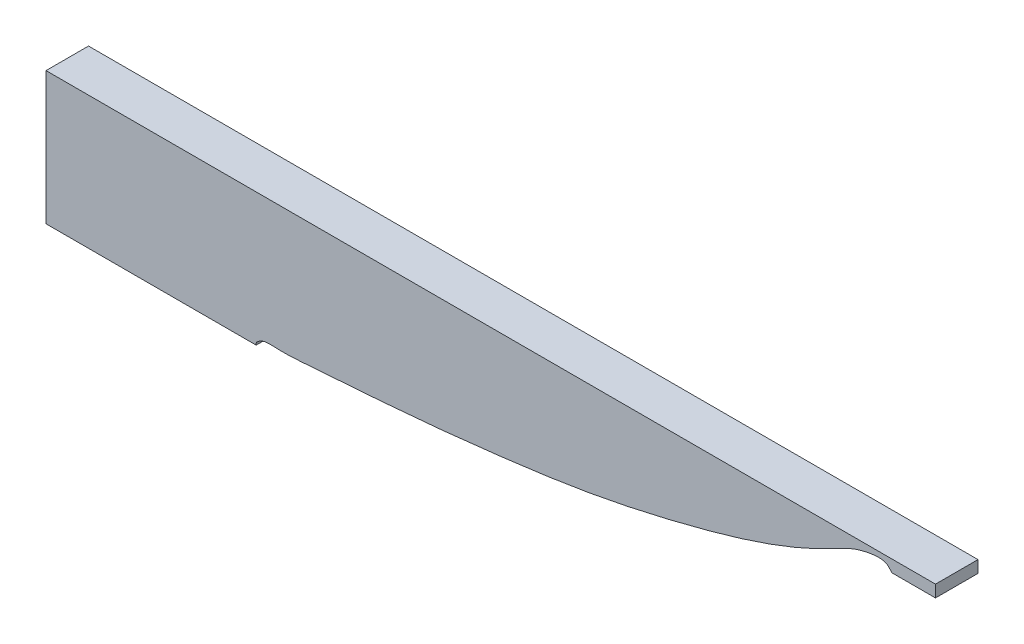
ISO-10303-21;
HEADER;
FILE_DESCRIPTION(('STEP AP214'),'2;1');
FILE_NAME('part.step','',(''),(''),'','','');
FILE_SCHEMA(('AUTOMOTIVE_DESIGN { 1 0 10303 214 1 1 1 1 }'));
ENDSEC;
DATA;
#1=APPLICATION_CONTEXT('core data for automotive mechanical design processes');
#2=APPLICATION_PROTOCOL_DEFINITION('international standard','automotive_design',2000,#1);
#3=PRODUCT_CONTEXT('',#1,'mechanical');
#4=PRODUCT('Part','Part','',(#3));
#5=PRODUCT_RELATED_PRODUCT_CATEGORY('part','',(#4));
#6=PRODUCT_DEFINITION_FORMATION('','',#4);
#7=PRODUCT_DEFINITION_CONTEXT('part definition',#1,'design');
#8=PRODUCT_DEFINITION('design','',#6,#7);
#9=PRODUCT_DEFINITION_SHAPE('','',#8);
#10=(LENGTH_UNIT() NAMED_UNIT(*) SI_UNIT(.MILLI.,.METRE.));
#11=(NAMED_UNIT(*) PLANE_ANGLE_UNIT() SI_UNIT($,.RADIAN.));
#12=(NAMED_UNIT(*) SI_UNIT($,.STERADIAN.) SOLID_ANGLE_UNIT());
#13=UNCERTAINTY_MEASURE_WITH_UNIT(LENGTH_MEASURE(1.E-05),#10,'distance_accuracy_value','');
#14=(GEOMETRIC_REPRESENTATION_CONTEXT(3) GLOBAL_UNCERTAINTY_ASSIGNED_CONTEXT((#13)) GLOBAL_UNIT_ASSIGNED_CONTEXT((#10,
#11,#12)) REPRESENTATION_CONTEXT('',''));
#15=CARTESIAN_POINT('',(0.,0.,0.));
#16=DIRECTION('',(0.,0.,1.));
#17=DIRECTION('',(1.,0.,0.));
#18=AXIS2_PLACEMENT_3D('',#15,#16,#17);
#19=CARTESIAN_POINT('',(-53.501553607029,-22.7129126053505,388.));
#20=CARTESIAN_POINT('',(-53.5136651916972,-22.6332925057675,388.));
#21=CARTESIAN_POINT('',(-53.5235654521542,-22.5520789650423,388.));
#22=CARTESIAN_POINT('',(-53.5093871831802,-22.3898624254855,388.));
#23=CARTESIAN_POINT('',(-53.4854963675788,-22.3099299450143,388.));
#24=CARTESIAN_POINT('',(-53.4058463463556,-22.16914541442,388.));
#25=CARTESIAN_POINT('',(-53.3473066319421,-22.109788049623,388.));
#26=CARTESIAN_POINT('',(-53.2219192166369,-22.0065731811502,388.));
#27=CARTESIAN_POINT('',(-53.1566978149585,-21.9577082551072,388.));
#28=CARTESIAN_POINT('',(-52.961780077917,-21.8114172538792,388.));
#29=CARTESIAN_POINT('',(-52.8277833749739,-21.7203630413607,388.));
#30=CARTESIAN_POINT('',(-52.5464302478947,-21.5595993384192,388.));
#31=CARTESIAN_POINT('',(-52.3959435596657,-21.4916825590442,388.));
#32=CARTESIAN_POINT('',(-51.9356555957146,-21.341621143552,388.));
#33=CARTESIAN_POINT('',(-51.6155739163836,-21.3013247484086,388.));
#34=CARTESIAN_POINT('',(-50.9686255316272,-21.2647884327513,388.));
#35=CARTESIAN_POINT('',(-50.6454678510764,-21.268081449743,388.));
#36=CARTESIAN_POINT('',(-49.9993567324343,-21.2885807311946,388.));
#37=CARTESIAN_POINT('',(-49.6764015507687,-21.3056682212169,388.));
#38=CARTESIAN_POINT('',(-49.0302870006583,-21.3259337468196,388.));
#39=CARTESIAN_POINT('',(-48.7075581415553,-21.3299856637048,388.));
#40=CARTESIAN_POINT('',(-47.7401907532244,-21.3273193733679,388.));
#41=CARTESIAN_POINT('',(-47.0964111859639,-21.3048803099471,388.));
#42=CARTESIAN_POINT('',(-45.8101302393674,-21.2366729037787,388.));
#43=CARTESIAN_POINT('',(-45.1674776240782,-21.1936648951953,388.));
#44=CARTESIAN_POINT('',(-43.8822048563402,-21.107056371517,388.));
#45=CARTESIAN_POINT('',(-43.2395647619462,-21.063819833581,388.));
#46=CARTESIAN_POINT('',(-41.3118416991595,-20.9305105850052,388.));
#47=CARTESIAN_POINT('',(-40.0269435992941,-20.8370636838958,388.));
#48=CARTESIAN_POINT('',(-33.6026933056114,-20.3654449837786,388.));
#49=CARTESIAN_POINT('',(-28.4633171969605,-19.9836038695058,388.));
#50=CARTESIAN_POINT('',(-18.198010298696,-19.0669156636558,388.));
#51=CARTESIAN_POINT('',(-13.0734639055001,-18.5207987959214,388.));
#52=CARTESIAN_POINT('',(-5.40131396202446,-17.5922484073368,388.));
#53=CARTESIAN_POINT('',(-2.84589665643548,-17.2665356810442,388.));
#54=CARTESIAN_POINT('',(2.25870754417883,-16.5637842686304,388.));
#55=CARTESIAN_POINT('',(4.80792966324237,-16.1839959758438,388.));
#56=CARTESIAN_POINT('',(9.89006638419954,-15.3351809516544,388.));
#57=CARTESIAN_POINT('',(12.4237942991878,-14.8652712337878,388.));
#58=CARTESIAN_POINT('',(17.4733870242095,-13.8351539201694,388.));
#59=CARTESIAN_POINT('',(19.9888614008621,-13.2780293434995,388.));
#60=CARTESIAN_POINT('',(25.0059470338664,-12.1012221776862,388.));
#61=CARTESIAN_POINT('',(27.5070011205054,-11.4797084468317,388.));
#62=CARTESIAN_POINT('',(32.4875183338313,-10.1590131060056,388.));
#63=CARTESIAN_POINT('',(34.9690956119489,-9.46266750042452,388.));
#64=CARTESIAN_POINT('',(38.6639482502241,-8.32819540487431,388.));
#65=CARTESIAN_POINT('',(39.8910057117155,-7.93424043415729,388.));
#66=CARTESIAN_POINT('',(42.3310153794474,-7.10638017343774,388.));
#67=CARTESIAN_POINT('',(43.5430462154359,-6.67209182083886,388.));
#68=CARTESIAN_POINT('',(45.9514121994037,-5.7634428320007,388.));
#69=CARTESIAN_POINT('',(47.1481072006109,-5.29000092838454,388.));
#70=CARTESIAN_POINT('',(49.5207838169133,-4.29023427314108,388.));
#71=CARTESIAN_POINT('',(50.6971797620267,-3.76319936738811,388.));
#72=CARTESIAN_POINT('',(52.4358965694022,-2.91377541906247,388.));
#73=CARTESIAN_POINT('',(53.0111223906027,-2.62093654904857,388.));
#74=CARTESIAN_POINT('',(54.1568208719534,-2.02465381931323,388.));
#75=CARTESIAN_POINT('',(54.7266377974459,-1.71974692073786,388.));
#76=CARTESIAN_POINT('',(56.4394069315837,-0.812429960854026,388.));
#77=CARTESIAN_POINT('',(57.5874400191104,-0.221356075129333,388.));
#78=CARTESIAN_POINT('',(59.3967061614354,0.470662104046205,388.));
#79=CARTESIAN_POINT('',(60.015006636714,0.667395191335033,388.));
#80=CARTESIAN_POINT('',(60.9669019754429,0.907955326890974,388.));
#81=CARTESIAN_POINT('',(61.2891502211906,0.97945663378666,388.));
#82=CARTESIAN_POINT('',(61.9346010821054,1.10128820005775,388.));
#83=CARTESIAN_POINT('',(62.2583984865566,1.1515264003774,388.));
#84=CARTESIAN_POINT('',(62.9083735027747,1.22829433338172,388.));
#85=CARTESIAN_POINT('',(63.2344899580529,1.2554332258764,388.));
#86=CARTESIAN_POINT('',(63.727305258649,1.25987856104167,388.));
#87=CARTESIAN_POINT('',(63.8921723413914,1.25543059242517,388.));
#88=CARTESIAN_POINT('',(64.2233305122225,1.2323506030561,388.));
#89=CARTESIAN_POINT('',(64.3877139465293,1.21323402633851,388.));
#90=CARTESIAN_POINT('',(64.7108221982199,1.14775491855892,388.));
#91=CARTESIAN_POINT('',(64.8721622251054,1.09990177481829,388.));
#92=CARTESIAN_POINT('',(65.1714311621995,0.958384513596108,388.));
#93=CARTESIAN_POINT('',(65.3056328018513,0.862266853773824,388.));
#94=CARTESIAN_POINT('',(65.5558543005868,0.642024872399099,388.));
#95=CARTESIAN_POINT('',(65.668515525338,0.519773971296058,388.));
#96=CARTESIAN_POINT('',(65.843293638862,0.34203534610108,388.));
#97=CARTESIAN_POINT('',(65.9018325830323,0.283061533275681,388.));
#98=CARTESIAN_POINT('',(66.0071039498784,0.153610492638516,388.));
#99=CARTESIAN_POINT('',(66.0510384753941,0.0815827353051586,388.));
#100=CARTESIAN_POINT('',(66.0708910742665,1.09124948660666E-13,388.));
#101=B_SPLINE_CURVE_WITH_KNOTS('',3,(#19,#20,#21,#22,#23,#24,#25,#26,#27,#28,#29,#30,#31,#32,
#33,#34,#35,#36,#37,#38,#39,#40,#41,#42,#43,#44,#45,#46,#47,#48,#49,#50,#51,#52,#53,#54,#55,#56,
#57,#58,#59,#60,#61,#62,#63,#64,#65,#66,#67,#68,#69,#70,#71,#72,#73,#74,#75,#76,#77,#78,#79,#80,
#81,#82,#83,#84,#85,#86,#87,#88,#89,#90,#91,#92,#93,#94,#95,#96,#97,#98,#99,#100),.UNSPECIFIED.,
.F.,.F.,(4,2,2,2,2,2,2,2,2,2,2,2,2,2,2,2,2,2,2,2,2,2,2,2,2,2,2,2,2,2,2,2,2,2,2,2,2,2,2,2,4),(0.,
0.00195312499999989,0.00390624999999978,0.00585937499999978,0.00781249999999978,
0.0117187499999997,0.0156249999999997,0.0234374999999997,0.0312499999999998,0.0390624999999999,
0.046875,0.0625,0.0781250000000001,0.0937500000000002,0.125,0.25,0.375,0.4375,0.5,0.5625,0.625,
0.6875,0.75,0.78125,0.8125,0.84375,0.875,0.890625,0.90625,0.9375,0.953125,0.9609375,0.96875,
0.976562500000001,0.980468750000001,0.984375,0.98828125,0.9921875,0.99609375,0.998046875,1.),.UNSPECIFIED.);
#102=DIRECTION('',(0.,0.,-1.));
#103=VECTOR('',#102,1.);
#104=SURFACE_OF_LINEAR_EXTRUSION('',#101,#103);
#105=CARTESIAN_POINT('',(-53.501553607029,-22.7129126053505,380.000000000001));
#106=CARTESIAN_POINT('',(-53.5136651916972,-22.6332925057675,380.000000000001));
#107=CARTESIAN_POINT('',(-53.5235654521542,-22.5520789650423,380.000000000001));
#108=CARTESIAN_POINT('',(-53.5093871831802,-22.3898624254855,380.000000000001));
#109=CARTESIAN_POINT('',(-53.4854963675788,-22.3099299450143,380.000000000001));
#110=CARTESIAN_POINT('',(-53.4058463463556,-22.16914541442,380.000000000001));
#111=CARTESIAN_POINT('',(-53.3473066319421,-22.109788049623,380.000000000001));
#112=CARTESIAN_POINT('',(-53.2219192166369,-22.0065731811502,380.000000000001));
#113=CARTESIAN_POINT('',(-53.1566978149585,-21.9577082551072,380.000000000001));
#114=CARTESIAN_POINT('',(-52.961780077917,-21.8114172538792,380.000000000001));
#115=CARTESIAN_POINT('',(-52.8277833749739,-21.7203630413607,380.000000000001));
#116=CARTESIAN_POINT('',(-52.5464302478947,-21.5595993384192,380.000000000001));
#117=CARTESIAN_POINT('',(-52.3959435596657,-21.4916825590442,380.000000000001));
#118=CARTESIAN_POINT('',(-51.9356555957146,-21.341621143552,380.000000000001));
#119=CARTESIAN_POINT('',(-51.6155739163836,-21.3013247484086,380.000000000001));
#120=CARTESIAN_POINT('',(-50.9686255316272,-21.2647884327513,380.000000000001));
#121=CARTESIAN_POINT('',(-50.6454678510764,-21.268081449743,380.000000000001));
#122=CARTESIAN_POINT('',(-49.9993567324343,-21.2885807311946,380.000000000001));
#123=CARTESIAN_POINT('',(-49.6764015507687,-21.3056682212169,380.000000000001));
#124=CARTESIAN_POINT('',(-49.0302870006583,-21.3259337468196,380.000000000001));
#125=CARTESIAN_POINT('',(-48.7075581415553,-21.3299856637048,380.000000000001));
#126=CARTESIAN_POINT('',(-47.7401907532244,-21.3273193733679,380.000000000001));
#127=CARTESIAN_POINT('',(-47.0964111859639,-21.3048803099471,380.000000000001));
#128=CARTESIAN_POINT('',(-45.8101302393674,-21.2366729037787,380.000000000001));
#129=CARTESIAN_POINT('',(-45.1674776240782,-21.1936648951953,380.000000000001));
#130=CARTESIAN_POINT('',(-43.8822048563402,-21.107056371517,380.000000000001));
#131=CARTESIAN_POINT('',(-43.2395647619462,-21.063819833581,380.000000000001));
#132=CARTESIAN_POINT('',(-41.3118416991595,-20.9305105850052,380.000000000001));
#133=CARTESIAN_POINT('',(-40.0269435992941,-20.8370636838958,380.000000000001));
#134=CARTESIAN_POINT('',(-33.6026933056114,-20.3654449837786,380.000000000001));
#135=CARTESIAN_POINT('',(-28.4633171969605,-19.9836038695058,380.000000000001));
#136=CARTESIAN_POINT('',(-18.198010298696,-19.0669156636558,380.000000000001));
#137=CARTESIAN_POINT('',(-13.0734639055001,-18.5207987959214,380.000000000001));
#138=CARTESIAN_POINT('',(-5.40131396202446,-17.5922484073368,380.000000000001));
#139=CARTESIAN_POINT('',(-2.84589665643548,-17.2665356810442,380.000000000001));
#140=CARTESIAN_POINT('',(2.25870754417883,-16.5637842686304,380.000000000001));
#141=CARTESIAN_POINT('',(4.80792966324237,-16.1839959758438,380.000000000001));
#142=CARTESIAN_POINT('',(9.89006638419954,-15.3351809516544,380.000000000001));
#143=CARTESIAN_POINT('',(12.4237942991878,-14.8652712337878,380.000000000001));
#144=CARTESIAN_POINT('',(17.4733870242095,-13.8351539201694,380.000000000001));
#145=CARTESIAN_POINT('',(19.9888614008621,-13.2780293434995,380.000000000001));
#146=CARTESIAN_POINT('',(25.0059470338664,-12.1012221776862,380.000000000001));
#147=CARTESIAN_POINT('',(27.5070011205054,-11.4797084468317,380.000000000001));
#148=CARTESIAN_POINT('',(32.4875183338313,-10.1590131060056,380.000000000001));
#149=CARTESIAN_POINT('',(34.9690956119489,-9.46266750042452,380.000000000001));
#150=CARTESIAN_POINT('',(38.6639482502241,-8.32819540487431,380.000000000001));
#151=CARTESIAN_POINT('',(39.8910057117155,-7.93424043415729,380.000000000001));
#152=CARTESIAN_POINT('',(42.3310153794474,-7.10638017343774,380.000000000001));
#153=CARTESIAN_POINT('',(43.5430462154359,-6.67209182083886,380.000000000001));
#154=CARTESIAN_POINT('',(45.9514121994037,-5.7634428320007,380.000000000001));
#155=CARTESIAN_POINT('',(47.1481072006109,-5.29000092838454,380.000000000001));
#156=CARTESIAN_POINT('',(49.5207838169133,-4.29023427314108,380.000000000001));
#157=CARTESIAN_POINT('',(50.6971797620267,-3.76319936738811,380.000000000001));
#158=CARTESIAN_POINT('',(52.4358965694022,-2.91377541906247,380.000000000001));
#159=CARTESIAN_POINT('',(53.0111223906027,-2.62093654904857,380.000000000001));
#160=CARTESIAN_POINT('',(54.1568208719534,-2.02465381931323,380.000000000001));
#161=CARTESIAN_POINT('',(54.7266377974459,-1.71974692073786,380.000000000001));
#162=CARTESIAN_POINT('',(56.4394069315837,-0.812429960854026,380.000000000001));
#163=CARTESIAN_POINT('',(57.5874400191104,-0.221356075129333,380.000000000001));
#164=CARTESIAN_POINT('',(59.3967061614354,0.470662104046205,380.000000000001));
#165=CARTESIAN_POINT('',(60.015006636714,0.667395191335033,380.000000000001));
#166=CARTESIAN_POINT('',(60.9669019754429,0.907955326890974,380.000000000001));
#167=CARTESIAN_POINT('',(61.2891502211906,0.97945663378666,380.000000000001));
#168=CARTESIAN_POINT('',(61.9346010821054,1.10128820005775,380.000000000001));
#169=CARTESIAN_POINT('',(62.2583984865566,1.1515264003774,380.000000000001));
#170=CARTESIAN_POINT('',(62.9083735027747,1.22829433338172,380.000000000001));
#171=CARTESIAN_POINT('',(63.2344899580529,1.2554332258764,380.000000000001));
#172=CARTESIAN_POINT('',(63.727305258649,1.25987856104167,380.000000000001));
#173=CARTESIAN_POINT('',(63.8921723413914,1.25543059242517,380.000000000001));
#174=CARTESIAN_POINT('',(64.2233305122225,1.2323506030561,380.000000000001));
#175=CARTESIAN_POINT('',(64.3877139465293,1.21323402633851,380.000000000001));
#176=CARTESIAN_POINT('',(64.7108221982199,1.14775491855892,380.000000000001));
#177=CARTESIAN_POINT('',(64.8721622251054,1.09990177481829,380.000000000001));
#178=CARTESIAN_POINT('',(65.1714311621995,0.958384513596108,380.000000000001));
#179=CARTESIAN_POINT('',(65.3056328018513,0.862266853773824,380.000000000001));
#180=CARTESIAN_POINT('',(65.5558543005868,0.642024872399099,380.000000000001));
#181=CARTESIAN_POINT('',(65.668515525338,0.519773971296058,380.000000000001));
#182=CARTESIAN_POINT('',(65.843293638862,0.34203534610108,380.000000000001));
#183=CARTESIAN_POINT('',(65.9018325830323,0.283061533275681,380.000000000001));
#184=CARTESIAN_POINT('',(66.0071039498784,0.153610492638516,380.000000000001));
#185=CARTESIAN_POINT('',(66.0510384753941,0.0815827353051586,380.000000000001));
#186=CARTESIAN_POINT('',(66.0708910742665,1.09124948660666E-13,380.000000000001));
#187=B_SPLINE_CURVE_WITH_KNOTS('',3,(#105,#106,#107,#108,#109,#110,#111,#112,#113,#114,#115,
#116,#117,#118,#119,#120,#121,#122,#123,#124,#125,#126,#127,#128,#129,#130,#131,#132,#133,#134,
#135,#136,#137,#138,#139,#140,#141,#142,#143,#144,#145,#146,#147,#148,#149,#150,#151,#152,#153,
#154,#155,#156,#157,#158,#159,#160,#161,#162,#163,#164,#165,#166,#167,#168,#169,#170,#171,#172,
#173,#174,#175,#176,#177,#178,#179,#180,#181,#182,#183,#184,#185,#186),.UNSPECIFIED.,.F.,.F.,(4,
2,2,2,2,2,2,2,2,2,2,2,2,2,2,2,2,2,2,2,2,2,2,2,2,2,2,2,2,2,2,2,2,2,2,2,2,2,2,2,4),(0.,
0.00195312499999989,0.00390624999999978,0.00585937499999978,0.00781249999999978,
0.0117187499999997,0.0156249999999997,0.0234374999999997,0.0312499999999998,0.0390624999999999,
0.046875,0.0625,0.0781250000000001,0.0937500000000002,0.125,0.25,0.375,0.4375,0.5,0.5625,0.625,
0.6875,0.75,0.78125,0.8125,0.84375,0.875,0.890625,0.90625,0.9375,0.953125,0.9609375,0.96875,
0.976562500000001,0.980468750000001,0.984375,0.98828125,0.9921875,0.99609375,0.998046875,1.),.UNSPECIFIED.);
#188=CARTESIAN_POINT('',(-53.5015536070289,-22.7129126053505,380.));
#189=VERTEX_POINT('',#188);
#190=CARTESIAN_POINT('',(66.0708910742666,0.,380.));
#191=VERTEX_POINT('',#190);
#192=EDGE_CURVE('E208',#189,#191,#187,.T.);
#193=ORIENTED_EDGE('',*,*,#192,.T.);
#194=DIRECTION('',(0.,0.,-1.));
#195=VECTOR('',#194,1.);
#196=CARTESIAN_POINT('',(66.0708910742666,0.,388.));
#197=LINE('',#196,#195);
#198=CARTESIAN_POINT('',(66.0708910742666,0.,388.));
#199=VERTEX_POINT('',#198);
#200=EDGE_CURVE('E11',#199,#191,#197,.T.);
#201=ORIENTED_EDGE('',*,*,#200,.F.);
#202=CARTESIAN_POINT('',(66.0708910742665,1.09124948660666E-13,388.));
#203=CARTESIAN_POINT('',(66.0510384753941,0.0815827353051586,388.));
#204=CARTESIAN_POINT('',(66.0071039498784,0.153610492638516,388.));
#205=CARTESIAN_POINT('',(65.9018325830323,0.283061533275681,388.));
#206=CARTESIAN_POINT('',(65.843293638862,0.34203534610108,388.));
#207=CARTESIAN_POINT('',(65.668515525338,0.519773971296058,388.));
#208=CARTESIAN_POINT('',(65.5558543005868,0.642024872399099,388.));
#209=CARTESIAN_POINT('',(65.3056328018513,0.862266853773824,388.));
#210=CARTESIAN_POINT('',(65.1714311621995,0.958384513596108,388.));
#211=CARTESIAN_POINT('',(64.8721622251054,1.09990177481829,388.));
#212=CARTESIAN_POINT('',(64.7108221982199,1.14775491855892,388.));
#213=CARTESIAN_POINT('',(64.3877139465293,1.21323402633851,388.));
#214=CARTESIAN_POINT('',(64.2233305122225,1.2323506030561,388.));
#215=CARTESIAN_POINT('',(63.8921723413914,1.25543059242517,388.));
#216=CARTESIAN_POINT('',(63.727305258649,1.25987856104167,388.));
#217=CARTESIAN_POINT('',(63.2344899580529,1.2554332258764,388.));
#218=CARTESIAN_POINT('',(62.9083735027747,1.22829433338172,388.));
#219=CARTESIAN_POINT('',(62.2583984865566,1.1515264003774,388.));
#220=CARTESIAN_POINT('',(61.9346010821054,1.10128820005775,388.));
#221=CARTESIAN_POINT('',(61.2891502211906,0.97945663378666,388.));
#222=CARTESIAN_POINT('',(60.9669019754429,0.907955326890974,388.));
#223=CARTESIAN_POINT('',(60.015006636714,0.667395191335033,388.));
#224=CARTESIAN_POINT('',(59.3967061614354,0.470662104046205,388.));
#225=CARTESIAN_POINT('',(57.5874400191104,-0.221356075129333,388.));
#226=CARTESIAN_POINT('',(56.4394069315837,-0.812429960854026,388.));
#227=CARTESIAN_POINT('',(54.7266377974459,-1.71974692073786,388.));
#228=CARTESIAN_POINT('',(54.1568208719534,-2.02465381931323,388.));
#229=CARTESIAN_POINT('',(53.0111223906027,-2.62093654904857,388.));
#230=CARTESIAN_POINT('',(52.4358965694022,-2.91377541906247,388.));
#231=CARTESIAN_POINT('',(50.6971797620267,-3.76319936738811,388.));
#232=CARTESIAN_POINT('',(49.5207838169133,-4.29023427314108,388.));
#233=CARTESIAN_POINT('',(47.1481072006109,-5.29000092838454,388.));
#234=CARTESIAN_POINT('',(45.9514121994037,-5.7634428320007,388.));
#235=CARTESIAN_POINT('',(43.5430462154359,-6.67209182083886,388.));
#236=CARTESIAN_POINT('',(42.3310153794474,-7.10638017343774,388.));
#237=CARTESIAN_POINT('',(39.8910057117155,-7.93424043415729,388.));
#238=CARTESIAN_POINT('',(38.6639482502241,-8.32819540487431,388.));
#239=CARTESIAN_POINT('',(34.9690956119489,-9.46266750042452,388.));
#240=CARTESIAN_POINT('',(32.4875183338313,-10.1590131060056,388.));
#241=CARTESIAN_POINT('',(27.5070011205054,-11.4797084468317,388.));
#242=CARTESIAN_POINT('',(25.0059470338664,-12.1012221776862,388.));
#243=CARTESIAN_POINT('',(19.9888614008621,-13.2780293434995,388.));
#244=CARTESIAN_POINT('',(17.4733870242095,-13.8351539201694,388.));
#245=CARTESIAN_POINT('',(12.4237942991878,-14.8652712337878,388.));
#246=CARTESIAN_POINT('',(9.89006638419954,-15.3351809516544,388.));
#247=CARTESIAN_POINT('',(4.80792966324237,-16.1839959758438,388.));
#248=CARTESIAN_POINT('',(2.25870754417883,-16.5637842686304,388.));
#249=CARTESIAN_POINT('',(-2.84589665643548,-17.2665356810442,388.));
#250=CARTESIAN_POINT('',(-5.40131396202446,-17.5922484073368,388.));
#251=CARTESIAN_POINT('',(-13.0734639055001,-18.5207987959214,388.));
#252=CARTESIAN_POINT('',(-18.198010298696,-19.0669156636558,388.));
#253=CARTESIAN_POINT('',(-28.4633171969605,-19.9836038695058,388.));
#254=CARTESIAN_POINT('',(-33.6026933056114,-20.3654449837786,388.));
#255=CARTESIAN_POINT('',(-40.0269435992941,-20.8370636838958,388.));
#256=CARTESIAN_POINT('',(-41.3118416991595,-20.9305105850052,388.));
#257=CARTESIAN_POINT('',(-43.2395647619462,-21.063819833581,388.));
#258=CARTESIAN_POINT('',(-43.8822048563402,-21.107056371517,388.));
#259=CARTESIAN_POINT('',(-45.1674776240782,-21.1936648951953,388.));
#260=CARTESIAN_POINT('',(-45.8101302393674,-21.2366729037787,388.));
#261=CARTESIAN_POINT('',(-47.0964111859639,-21.3048803099471,388.));
#262=CARTESIAN_POINT('',(-47.7401907532244,-21.3273193733679,388.));
#263=CARTESIAN_POINT('',(-48.7075581415553,-21.3299856637048,388.));
#264=CARTESIAN_POINT('',(-49.0302870006583,-21.3259337468196,388.));
#265=CARTESIAN_POINT('',(-49.6764015507687,-21.3056682212169,388.));
#266=CARTESIAN_POINT('',(-49.9993567324343,-21.2885807311946,388.));
#267=CARTESIAN_POINT('',(-50.6454678510764,-21.268081449743,388.));
#268=CARTESIAN_POINT('',(-50.9686255316272,-21.2647884327513,388.));
#269=CARTESIAN_POINT('',(-51.6155739163836,-21.3013247484086,388.));
#270=CARTESIAN_POINT('',(-51.9356555957146,-21.341621143552,388.));
#271=CARTESIAN_POINT('',(-52.3959435596657,-21.4916825590442,388.));
#272=CARTESIAN_POINT('',(-52.5464302478947,-21.5595993384192,388.));
#273=CARTESIAN_POINT('',(-52.8277833749739,-21.7203630413607,388.));
#274=CARTESIAN_POINT('',(-52.961780077917,-21.8114172538792,388.));
#275=CARTESIAN_POINT('',(-53.1566978149585,-21.9577082551072,388.));
#276=CARTESIAN_POINT('',(-53.2219192166369,-22.0065731811502,388.));
#277=CARTESIAN_POINT('',(-53.3473066319421,-22.109788049623,388.));
#278=CARTESIAN_POINT('',(-53.4058463463556,-22.16914541442,388.));
#279=CARTESIAN_POINT('',(-53.4854963675788,-22.3099299450143,388.));
#280=CARTESIAN_POINT('',(-53.5093871831802,-22.3898624254855,388.));
#281=CARTESIAN_POINT('',(-53.5235654521542,-22.5520789650423,388.));
#282=CARTESIAN_POINT('',(-53.5136651916972,-22.6332925057675,388.));
#283=CARTESIAN_POINT('',(-53.501553607029,-22.7129126053505,388.));
#284=B_SPLINE_CURVE_WITH_KNOTS('',3,(#202,#203,#204,#205,#206,#207,#208,#209,#210,#211,#212,
#213,#214,#215,#216,#217,#218,#219,#220,#221,#222,#223,#224,#225,#226,#227,#228,#229,#230,#231,
#232,#233,#234,#235,#236,#237,#238,#239,#240,#241,#242,#243,#244,#245,#246,#247,#248,#249,#250,
#251,#252,#253,#254,#255,#256,#257,#258,#259,#260,#261,#262,#263,#264,#265,#266,#267,#268,#269,
#270,#271,#272,#273,#274,#275,#276,#277,#278,#279,#280,#281,#282,#283),.UNSPECIFIED.,.F.,.F.,(4,
2,2,2,2,2,2,2,2,2,2,2,2,2,2,2,2,2,2,2,2,2,2,2,2,2,2,2,2,2,2,2,2,2,2,2,2,2,2,2,4),(0.,
0.00195312499999989,0.00390624999999967,0.00781249999999967,0.0117187499999996,
0.0156249999999996,0.0195312499999994,0.0234374999999994,0.0312499999999997,0.0390624999999997,
0.0468749999999997,0.0624999999999998,0.09375,0.109375,0.125,0.15625,0.1875,0.21875,0.25,0.3125,
0.375,0.4375,0.5,0.5625,0.625,0.75,0.875,0.90625,0.921875,0.9375,0.953125,0.9609375,0.96875,
0.9765625,0.984375,0.98828125,0.9921875,0.994140625,0.99609375,0.998046875,1.),.UNSPECIFIED.);
#285=CARTESIAN_POINT('',(-53.5015536070289,-22.7129126053505,388.));
#286=VERTEX_POINT('',#285);
#287=EDGE_CURVE('E191',#286,#199,#284,.F.);
#288=ORIENTED_EDGE('',*,*,#287,.F.);
#289=DIRECTION('',(0.,0.,-1.));
#290=VECTOR('',#289,1.);
#291=CARTESIAN_POINT('',(-53.5015536070289,-22.7129126053505,388.));
#292=LINE('',#291,#290);
#293=EDGE_CURVE('E116',#286,#189,#292,.T.);
#294=ORIENTED_EDGE('',*,*,#293,.T.);
#295=EDGE_LOOP('',(#193,#201,#288,#294));
#296=FACE_BOUND('',#295,.T.);
#297=ADVANCED_FACE('F30',(#296),#104,.F.);
#298=CARTESIAN_POINT('',(66.0708910742666,0.,388.));
#299=DIRECTION('',(0.,1.,0.));
#300=DIRECTION('',(-1.,0.,0.));
#301=AXIS2_PLACEMENT_3D('',#298,#299,#300);
#302=PLANE('',#301);
#303=DIRECTION('',(1.,0.,0.));
#304=VECTOR('',#303,1.);
#305=CARTESIAN_POINT('',(66.0708910742666,0.,380.));
#306=LINE('',#305,#304);
#307=CARTESIAN_POINT('',(74.3311474476057,0.,380.));
#308=VERTEX_POINT('',#307);
#309=EDGE_CURVE('E161',#191,#308,#306,.T.);
#310=ORIENTED_EDGE('',*,*,#309,.T.);
#311=DIRECTION('',(0.,0.,-1.));
#312=VECTOR('',#311,1.);
#313=CARTESIAN_POINT('',(74.3311474476057,0.,388.));
#314=LINE('',#313,#312);
#315=CARTESIAN_POINT('',(74.3311474476057,0.,388.));
#316=VERTEX_POINT('',#315);
#317=EDGE_CURVE('E41',#316,#308,#314,.T.);
#318=ORIENTED_EDGE('',*,*,#317,.F.);
#319=DIRECTION('',(1.,0.,0.));
#320=VECTOR('',#319,1.);
#321=CARTESIAN_POINT('',(66.0708910742666,0.,388.));
#322=LINE('',#321,#320);
#323=EDGE_CURVE('E89',#199,#316,#322,.T.);
#324=ORIENTED_EDGE('',*,*,#323,.F.);
#325=ORIENTED_EDGE('',*,*,#200,.T.);
#326=EDGE_LOOP('',(#310,#318,#324,#325));
#327=FACE_BOUND('',#326,.T.);
#328=ADVANCED_FACE('F226',(#327),#302,.F.);
#329=CARTESIAN_POINT('',(74.3311474476057,2.25600000000005,388.));
#330=DIRECTION('',(-1.,0.,0.));
#331=DIRECTION('',(0.,-1.,0.));
#332=AXIS2_PLACEMENT_3D('',#329,#330,#331);
#333=PLANE('',#332);
#334=DIRECTION('',(0.,1.,0.));
#335=VECTOR('',#334,1.);
#336=CARTESIAN_POINT('',(74.3311474476057,2.25600000000005,380.));
#337=LINE('',#336,#335);
#338=CARTESIAN_POINT('',(74.3311474476057,2.25600000000005,380.));
#339=VERTEX_POINT('',#338);
#340=EDGE_CURVE('E156',#308,#339,#337,.T.);
#341=ORIENTED_EDGE('',*,*,#340,.T.);
#342=DIRECTION('',(0.,0.,-1.));
#343=VECTOR('',#342,1.);
#344=CARTESIAN_POINT('',(74.3311474476057,2.25600000000005,388.));
#345=LINE('',#344,#343);
#346=CARTESIAN_POINT('',(74.3311474476057,2.25600000000005,388.));
#347=VERTEX_POINT('',#346);
#348=EDGE_CURVE('E111',#347,#339,#345,.T.);
#349=ORIENTED_EDGE('',*,*,#348,.F.);
#350=DIRECTION('',(0.,1.,0.));
#351=VECTOR('',#350,1.);
#352=CARTESIAN_POINT('',(74.3311474476057,2.25600000000005,388.));
#353=LINE('',#352,#351);
#354=EDGE_CURVE('E102',#316,#347,#353,.T.);
#355=ORIENTED_EDGE('',*,*,#354,.F.);
#356=ORIENTED_EDGE('',*,*,#317,.T.);
#357=EDGE_LOOP('',(#341,#349,#355,#356));
#358=FACE_BOUND('',#357,.T.);
#359=ADVANCED_FACE('F229',(#358),#333,.F.);
#360=CARTESIAN_POINT('',(74.3311474476057,2.25600000000005,388.));
#361=DIRECTION('',(0.,-1.,0.));
#362=DIRECTION('',(1.,0.,0.));
#363=AXIS2_PLACEMENT_3D('',#360,#361,#362);
#364=PLANE('',#363);
#365=DIRECTION('',(-1.,0.,0.));
#366=VECTOR('',#365,1.);
#367=CARTESIAN_POINT('',(74.3311474476057,2.25600000000005,380.));
#368=LINE('',#367,#366);
#369=CARTESIAN_POINT('',(-93.0467718422326,2.25600000000003,380.));
#370=VERTEX_POINT('',#369);
#371=EDGE_CURVE('E110',#339,#370,#368,.T.);
#372=ORIENTED_EDGE('',*,*,#371,.T.);
#373=DIRECTION('',(0.,0.,-1.));
#374=VECTOR('',#373,1.);
#375=CARTESIAN_POINT('',(-93.0467718422326,2.25600000000003,388.));
#376=LINE('',#375,#374);
#377=CARTESIAN_POINT('',(-93.0467718422326,2.25600000000003,388.));
#378=VERTEX_POINT('',#377);
#379=EDGE_CURVE('E107',#378,#370,#376,.T.);
#380=ORIENTED_EDGE('',*,*,#379,.F.);
#381=DIRECTION('',(-1.,0.,0.));
#382=VECTOR('',#381,1.);
#383=CARTESIAN_POINT('',(74.3311474476057,2.25600000000005,388.));
#384=LINE('',#383,#382);
#385=EDGE_CURVE('E96',#347,#378,#384,.T.);
#386=ORIENTED_EDGE('',*,*,#385,.F.);
#387=ORIENTED_EDGE('',*,*,#348,.T.);
#388=EDGE_LOOP('',(#372,#380,#386,#387));
#389=FACE_BOUND('',#388,.T.);
#390=ADVANCED_FACE('F108',(#389),#364,.F.);
#391=CARTESIAN_POINT('',(-93.0467718422292,-22.7136140661034,388.));
#392=DIRECTION('',(1.,1.38390972123064E-13,0.));
#393=DIRECTION('',(-1.38390972123064E-13,1.,0.));
#394=AXIS2_PLACEMENT_3D('',#391,#392,#393);
#395=PLANE('',#394);
#396=DIRECTION('',(1.38390972123064E-13,-1.,0.));
#397=VECTOR('',#396,1.);
#398=CARTESIAN_POINT('',(-93.0467718422292,-22.7136140661034,380.));
#399=LINE('',#398,#397);
#400=CARTESIAN_POINT('',(-93.0467718422292,-22.7136140661034,380.));
#401=VERTEX_POINT('',#400);
#402=EDGE_CURVE('E74',#370,#401,#399,.T.);
#403=ORIENTED_EDGE('',*,*,#402,.T.);
#404=DIRECTION('',(0.,0.,-1.));
#405=VECTOR('',#404,1.);
#406=CARTESIAN_POINT('',(-93.0467718422292,-22.7136140661034,388.));
#407=LINE('',#406,#405);
#408=CARTESIAN_POINT('',(-93.0467718422292,-22.7136140661034,388.));
#409=VERTEX_POINT('',#408);
#410=EDGE_CURVE('E112',#409,#401,#407,.T.);
#411=ORIENTED_EDGE('',*,*,#410,.F.);
#412=DIRECTION('',(1.38390972123064E-13,-1.,0.));
#413=VECTOR('',#412,1.);
#414=CARTESIAN_POINT('',(-93.0467718422292,-22.7136140661034,388.));
#415=LINE('',#414,#413);
#416=EDGE_CURVE('E100',#378,#409,#415,.T.);
#417=ORIENTED_EDGE('',*,*,#416,.F.);
#418=ORIENTED_EDGE('',*,*,#379,.T.);
#419=EDGE_LOOP('',(#403,#411,#417,#418));
#420=FACE_BOUND('',#419,.T.);
#421=ADVANCED_FACE('F114',(#420),#395,.F.);
#422=CARTESIAN_POINT('',(-93.0467718422326,-22.7136140661078,388.));
#423=CARTESIAN_POINT('',(-79.865032429411,-22.7134527740389,388.));
#424=CARTESIAN_POINT('',(-66.6832930173143,-22.7132173624312,388.));
#425=CARTESIAN_POINT('',(-53.5015536070289,-22.7129126053505,388.));
#426=B_SPLINE_CURVE_WITH_KNOTS('',3,(#422,#423,#424,#425),.UNSPECIFIED.,.F.,.F.,(4,4),(0.,1.),.UNSPECIFIED.);
#427=DIRECTION('',(0.,0.,-1.));
#428=VECTOR('',#427,1.);
#429=SURFACE_OF_LINEAR_EXTRUSION('',#426,#428);
#430=CARTESIAN_POINT('',(-93.0467718422326,-22.7136140661078,380.));
#431=CARTESIAN_POINT('',(-79.865032429411,-22.7134527740389,380.));
#432=CARTESIAN_POINT('',(-66.6832930173143,-22.7132173624312,380.));
#433=CARTESIAN_POINT('',(-53.5015536070289,-22.7129126053505,380.));
#434=B_SPLINE_CURVE_WITH_KNOTS('',3,(#430,#431,#432,#433),.UNSPECIFIED.,.F.,.F.,(4,4),(0.,1.),.UNSPECIFIED.);
#435=EDGE_CURVE('E80',#401,#189,#434,.T.);
#436=ORIENTED_EDGE('',*,*,#435,.T.);
#437=ORIENTED_EDGE('',*,*,#293,.F.);
#438=CARTESIAN_POINT('',(-53.5015536070289,-22.7129126053505,388.));
#439=CARTESIAN_POINT('',(-66.6832930173143,-22.7132173624312,388.));
#440=CARTESIAN_POINT('',(-79.865032429411,-22.7134527740389,388.));
#441=CARTESIAN_POINT('',(-93.0467718422326,-22.7136140661078,388.));
#442=B_SPLINE_CURVE_WITH_KNOTS('',3,(#438,#439,#440,#441),.UNSPECIFIED.,.F.,.F.,(4,4),(0.,1.),.UNSPECIFIED.);
#443=EDGE_CURVE('E50',#409,#286,#442,.F.);
#444=ORIENTED_EDGE('',*,*,#443,.F.);
#445=ORIENTED_EDGE('',*,*,#410,.T.);
#446=EDGE_LOOP('',(#436,#437,#444,#445));
#447=FACE_BOUND('',#446,.T.);
#448=ADVANCED_FACE('F135',(#447),#429,.F.);
#449=CARTESIAN_POINT('',(7.34899802372098,-15.7595884637491,388.));
#450=DIRECTION('',(0.,0.,-1.));
#451=DIRECTION('',(-1.,0.,0.));
#452=AXIS2_PLACEMENT_3D('',#449,#450,#451);
#453=PLANE('',#452);
#454=ORIENTED_EDGE('',*,*,#287,.T.);
#455=ORIENTED_EDGE('',*,*,#323,.T.);
#456=ORIENTED_EDGE('',*,*,#354,.T.);
#457=ORIENTED_EDGE('',*,*,#385,.T.);
#458=ORIENTED_EDGE('',*,*,#416,.T.);
#459=ORIENTED_EDGE('',*,*,#443,.T.);
#460=EDGE_LOOP('',(#454,#455,#456,#457,#458,#459));
#461=FACE_BOUND('',#460,.T.);
#462=ADVANCED_FACE('F98',(#461),#453,.F.);
#463=CARTESIAN_POINT('',(7.34899802372098,-15.7595884637491,380.));
#464=DIRECTION('',(0.,0.,-1.));
#465=DIRECTION('',(-1.,0.,0.));
#466=AXIS2_PLACEMENT_3D('',#463,#464,#465);
#467=PLANE('',#466);
#468=ORIENTED_EDGE('',*,*,#192,.F.);
#469=ORIENTED_EDGE('',*,*,#435,.F.);
#470=ORIENTED_EDGE('',*,*,#402,.F.);
#471=ORIENTED_EDGE('',*,*,#371,.F.);
#472=ORIENTED_EDGE('',*,*,#340,.F.);
#473=ORIENTED_EDGE('',*,*,#309,.F.);
#474=EDGE_LOOP('',(#468,#469,#470,#471,#472,#473));
#475=FACE_BOUND('',#474,.T.);
#476=ADVANCED_FACE('F146',(#475),#467,.T.);
#477=CLOSED_SHELL('',(#297,#328,#359,#390,#421,#448,#462,#476));
#478=MANIFOLD_SOLID_BREP('B2',#477);
#479=ADVANCED_BREP_SHAPE_REPRESENTATION('',(#18,#478),#14);
#480=SHAPE_DEFINITION_REPRESENTATION(#9,#479);
ENDSEC;
END-ISO-10303-21;
